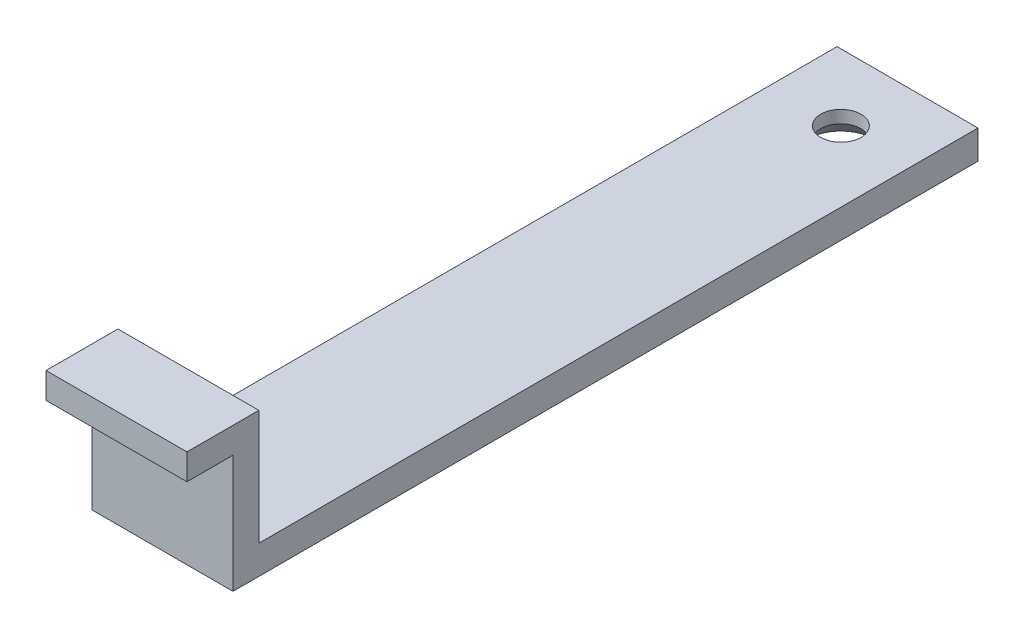
ISO-10303-21;
HEADER;
FILE_DESCRIPTION(('STEP AP214'),'2;1');
FILE_NAME('part.step','',(''),(''),'','','');
FILE_SCHEMA(('AUTOMOTIVE_DESIGN { 1 0 10303 214 1 1 1 1 }'));
ENDSEC;
DATA;
#1=APPLICATION_CONTEXT('core data for automotive mechanical design processes');
#2=APPLICATION_PROTOCOL_DEFINITION('international standard','automotive_design',2000,#1);
#3=PRODUCT_CONTEXT('',#1,'mechanical');
#4=PRODUCT('Part','Part','',(#3));
#5=PRODUCT_RELATED_PRODUCT_CATEGORY('part','',(#4));
#6=PRODUCT_DEFINITION_FORMATION('','',#4);
#7=PRODUCT_DEFINITION_CONTEXT('part definition',#1,'design');
#8=PRODUCT_DEFINITION('design','',#6,#7);
#9=PRODUCT_DEFINITION_SHAPE('','',#8);
#10=(LENGTH_UNIT() NAMED_UNIT(*) SI_UNIT(.MILLI.,.METRE.));
#11=(NAMED_UNIT(*) PLANE_ANGLE_UNIT() SI_UNIT($,.RADIAN.));
#12=(NAMED_UNIT(*) SI_UNIT($,.STERADIAN.) SOLID_ANGLE_UNIT());
#13=UNCERTAINTY_MEASURE_WITH_UNIT(LENGTH_MEASURE(1.E-05),#10,'distance_accuracy_value','');
#14=(GEOMETRIC_REPRESENTATION_CONTEXT(3) GLOBAL_UNCERTAINTY_ASSIGNED_CONTEXT((#13)) GLOBAL_UNIT_ASSIGNED_CONTEXT((#10,
#11,#12)) REPRESENTATION_CONTEXT('',''));
#15=CARTESIAN_POINT('',(0.,0.,0.));
#16=DIRECTION('',(0.,0.,1.));
#17=DIRECTION('',(1.,0.,0.));
#18=AXIS2_PLACEMENT_3D('',#15,#16,#17);
#19=CARTESIAN_POINT('',(-3.1115,3.175,-0.5715));
#20=DIRECTION('',(0.,0.,1.));
#21=DIRECTION('',(1.,0.,0.));
#22=AXIS2_PLACEMENT_3D('',#19,#20,#21);
#23=PLANE('',#22);
#24=DIRECTION('',(1.,0.,0.));
#25=VECTOR('',#24,1.);
#26=CARTESIAN_POINT('',(3.1115,-1.905,-0.5715));
#27=LINE('',#26,#25);
#28=CARTESIAN_POINT('',(-3.1115,-1.905,-0.5715));
#29=VERTEX_POINT('',#28);
#30=CARTESIAN_POINT('',(3.1115,-1.905,-0.5715));
#31=VERTEX_POINT('',#30);
#32=EDGE_CURVE('E64',#29,#31,#27,.T.);
#33=ORIENTED_EDGE('',*,*,#32,.F.);
#34=DIRECTION('',(0.,-1.,0.));
#35=VECTOR('',#34,1.);
#36=CARTESIAN_POINT('',(-3.1115,3.175,-0.5715));
#37=LINE('',#36,#35);
#38=CARTESIAN_POINT('',(-3.1115,3.175,-0.5715));
#39=VERTEX_POINT('',#38);
#40=EDGE_CURVE('E58',#39,#29,#37,.T.);
#41=ORIENTED_EDGE('',*,*,#40,.F.);
#42=DIRECTION('',(-1.,0.,0.));
#43=VECTOR('',#42,1.);
#44=CARTESIAN_POINT('',(-3.1115,3.175,-0.5715));
#45=LINE('',#44,#43);
#46=CARTESIAN_POINT('',(3.1115,3.175,-0.5715));
#47=VERTEX_POINT('',#46);
#48=EDGE_CURVE('E172',#47,#39,#45,.T.);
#49=ORIENTED_EDGE('',*,*,#48,.F.);
#50=DIRECTION('',(0.,-1.,0.));
#51=VECTOR('',#50,1.);
#52=CARTESIAN_POINT('',(3.1115,3.175,-0.5715));
#53=LINE('',#52,#51);
#54=EDGE_CURVE('E13',#47,#31,#53,.T.);
#55=ORIENTED_EDGE('',*,*,#54,.T.);
#56=EDGE_LOOP('',(#33,#41,#49,#55));
#57=FACE_BOUND('',#56,.T.);
#58=ADVANCED_FACE('F49',(#57),#23,.F.);
#59=CARTESIAN_POINT('',(-3.1115,3.175,0.5715));
#60=DIRECTION('',(0.,0.,-1.));
#61=DIRECTION('',(-1.,0.,0.));
#62=AXIS2_PLACEMENT_3D('',#59,#60,#61);
#63=PLANE('',#62);
#64=DIRECTION('',(1.,0.,0.));
#65=VECTOR('',#64,1.);
#66=CARTESIAN_POINT('',(-3.1115,2.032,0.5715));
#67=LINE('',#66,#65);
#68=CARTESIAN_POINT('',(-3.1115,2.032,0.5715));
#69=VERTEX_POINT('',#68);
#70=CARTESIAN_POINT('',(3.1115,2.032,0.5715));
#71=VERTEX_POINT('',#70);
#72=EDGE_CURVE('E72',#69,#71,#67,.T.);
#73=ORIENTED_EDGE('',*,*,#72,.F.);
#74=DIRECTION('',(0.,-1.,0.));
#75=VECTOR('',#74,1.);
#76=CARTESIAN_POINT('',(-3.1115,3.175,0.5715));
#77=LINE('',#76,#75);
#78=CARTESIAN_POINT('',(-3.1115,-3.175,0.5715));
#79=VERTEX_POINT('',#78);
#80=EDGE_CURVE('E180',#69,#79,#77,.T.);
#81=ORIENTED_EDGE('',*,*,#80,.T.);
#82=DIRECTION('',(1.,0.,0.));
#83=VECTOR('',#82,1.);
#84=CARTESIAN_POINT('',(-3.1115,-3.175,0.5715));
#85=LINE('',#84,#83);
#86=CARTESIAN_POINT('',(3.1115,-3.175,0.5715));
#87=VERTEX_POINT('',#86);
#88=EDGE_CURVE('E173',#79,#87,#85,.T.);
#89=ORIENTED_EDGE('',*,*,#88,.T.);
#90=DIRECTION('',(0.,-1.,0.));
#91=VECTOR('',#90,1.);
#92=CARTESIAN_POINT('',(3.1115,3.175,0.5715));
#93=LINE('',#92,#91);
#94=EDGE_CURVE('E121',#71,#87,#93,.T.);
#95=ORIENTED_EDGE('',*,*,#94,.F.);
#96=EDGE_LOOP('',(#73,#81,#89,#95));
#97=FACE_BOUND('',#96,.T.);
#98=ADVANCED_FACE('F211',(#97),#63,.F.);
#99=CARTESIAN_POINT('',(3.1115,3.175,-0.5715));
#100=DIRECTION('',(-1.,0.,0.));
#101=DIRECTION('',(0.,0.,1.));
#102=AXIS2_PLACEMENT_3D('',#99,#100,#101);
#103=PLANE('',#102);
#104=DIRECTION('',(0.,0.,-1.));
#105=VECTOR('',#104,1.);
#106=CARTESIAN_POINT('',(3.1115,-3.175,-0.5715));
#107=LINE('',#106,#105);
#108=CARTESIAN_POINT('',(3.1115,-3.175,-32.3215));
#109=VERTEX_POINT('',#108);
#110=EDGE_CURVE('E115',#87,#109,#107,.T.);
#111=ORIENTED_EDGE('',*,*,#110,.T.);
#112=DIRECTION('',(0.,-1.,0.));
#113=VECTOR('',#112,1.);
#114=CARTESIAN_POINT('',(3.1115,-3.175,-32.3215));
#115=LINE('',#114,#113);
#116=CARTESIAN_POINT('',(3.1115,-1.905,-32.3215));
#117=VERTEX_POINT('',#116);
#118=EDGE_CURVE('E119',#117,#109,#115,.T.);
#119=ORIENTED_EDGE('',*,*,#118,.F.);
#120=DIRECTION('',(0.,0.,1.));
#121=VECTOR('',#120,1.);
#122=CARTESIAN_POINT('',(3.1115,-1.905,-32.3215));
#123=LINE('',#122,#121);
#124=EDGE_CURVE('E147',#117,#31,#123,.T.);
#125=ORIENTED_EDGE('',*,*,#124,.T.);
#126=ORIENTED_EDGE('',*,*,#54,.F.);
#127=DIRECTION('',(0.,0.,-1.));
#128=VECTOR('',#127,1.);
#129=CARTESIAN_POINT('',(3.1115,3.175,-0.5715));
#130=LINE('',#129,#128);
#131=CARTESIAN_POINT('',(3.1115,3.175,2.6035));
#132=VERTEX_POINT('',#131);
#133=EDGE_CURVE('E169',#132,#47,#130,.T.);
#134=ORIENTED_EDGE('',*,*,#133,.F.);
#135=DIRECTION('',(0.,1.,0.));
#136=VECTOR('',#135,1.);
#137=CARTESIAN_POINT('',(3.1115,3.175,2.6035));
#138=LINE('',#137,#136);
#139=CARTESIAN_POINT('',(3.1115,2.032,2.6035));
#140=VERTEX_POINT('',#139);
#141=EDGE_CURVE('E158',#140,#132,#138,.T.);
#142=ORIENTED_EDGE('',*,*,#141,.F.);
#143=DIRECTION('',(0.,0.,-1.));
#144=VECTOR('',#143,1.);
#145=CARTESIAN_POINT('',(3.1115,2.032,2.6035));
#146=LINE('',#145,#144);
#147=EDGE_CURVE('E164',#140,#71,#146,.T.);
#148=ORIENTED_EDGE('',*,*,#147,.T.);
#149=ORIENTED_EDGE('',*,*,#94,.T.);
#150=EDGE_LOOP('',(#111,#119,#125,#126,#134,#142,#148,#149));
#151=FACE_BOUND('',#150,.T.);
#152=ADVANCED_FACE('F51',(#151),#103,.F.);
#153=CARTESIAN_POINT('',(-3.1115,3.175,-0.5715));
#154=DIRECTION('',(1.,0.,0.));
#155=DIRECTION('',(0.,0.,-1.));
#156=AXIS2_PLACEMENT_3D('',#153,#154,#155);
#157=PLANE('',#156);
#158=DIRECTION('',(0.,0.,1.));
#159=VECTOR('',#158,1.);
#160=CARTESIAN_POINT('',(-3.1115,-3.175,-0.5715));
#161=LINE('',#160,#159);
#162=CARTESIAN_POINT('',(-3.1115,-3.175,-32.3215));
#163=VERTEX_POINT('',#162);
#164=EDGE_CURVE('E125',#163,#79,#161,.T.);
#165=ORIENTED_EDGE('',*,*,#164,.T.);
#166=ORIENTED_EDGE('',*,*,#80,.F.);
#167=DIRECTION('',(0.,0.,-1.));
#168=VECTOR('',#167,1.);
#169=CARTESIAN_POINT('',(-3.1115,2.032,2.6035));
#170=LINE('',#169,#168);
#171=CARTESIAN_POINT('',(-3.1115,2.032,2.6035));
#172=VERTEX_POINT('',#171);
#173=EDGE_CURVE('E126',#172,#69,#170,.T.);
#174=ORIENTED_EDGE('',*,*,#173,.F.);
#175=DIRECTION('',(0.,-1.,0.));
#176=VECTOR('',#175,1.);
#177=CARTESIAN_POINT('',(-3.1115,3.175,2.6035));
#178=LINE('',#177,#176);
#179=CARTESIAN_POINT('',(-3.1115,3.175,2.6035));
#180=VERTEX_POINT('',#179);
#181=EDGE_CURVE('E153',#180,#172,#178,.T.);
#182=ORIENTED_EDGE('',*,*,#181,.F.);
#183=DIRECTION('',(0.,0.,1.));
#184=VECTOR('',#183,1.);
#185=CARTESIAN_POINT('',(-3.1115,3.175,-0.5715));
#186=LINE('',#185,#184);
#187=EDGE_CURVE('E175',#39,#180,#186,.T.);
#188=ORIENTED_EDGE('',*,*,#187,.F.);
#189=ORIENTED_EDGE('',*,*,#40,.T.);
#190=DIRECTION('',(0.,0.,1.));
#191=VECTOR('',#190,1.);
#192=CARTESIAN_POINT('',(-3.1115,-1.905,-32.3215));
#193=LINE('',#192,#191);
#194=CARTESIAN_POINT('',(-3.1115,-1.905,-32.3215));
#195=VERTEX_POINT('',#194);
#196=EDGE_CURVE('E150',#195,#29,#193,.T.);
#197=ORIENTED_EDGE('',*,*,#196,.F.);
#198=DIRECTION('',(0.,1.,0.));
#199=VECTOR('',#198,1.);
#200=CARTESIAN_POINT('',(-3.1115,-3.175,-32.3215));
#201=LINE('',#200,#199);
#202=EDGE_CURVE('E134',#163,#195,#201,.T.);
#203=ORIENTED_EDGE('',*,*,#202,.F.);
#204=EDGE_LOOP('',(#165,#166,#174,#182,#188,#189,#197,#203));
#205=FACE_BOUND('',#204,.T.);
#206=ADVANCED_FACE('F185',(#205),#157,.F.);
#207=CARTESIAN_POINT('',(0.,3.175,0.));
#208=DIRECTION('',(0.,1.,0.));
#209=DIRECTION('',(0.,0.,1.));
#210=AXIS2_PLACEMENT_3D('',#207,#208,#209);
#211=PLANE('',#210);
#212=ORIENTED_EDGE('',*,*,#133,.T.);
#213=ORIENTED_EDGE('',*,*,#48,.T.);
#214=ORIENTED_EDGE('',*,*,#187,.T.);
#215=DIRECTION('',(-1.,0.,0.));
#216=VECTOR('',#215,1.);
#217=CARTESIAN_POINT('',(-3.1115,3.175,2.6035));
#218=LINE('',#217,#216);
#219=EDGE_CURVE('E161',#132,#180,#218,.T.);
#220=ORIENTED_EDGE('',*,*,#219,.F.);
#221=EDGE_LOOP('',(#212,#213,#214,#220));
#222=FACE_BOUND('',#221,.T.);
#223=ADVANCED_FACE('F193',(#222),#211,.T.);
#224=CARTESIAN_POINT('',(0.,-3.175,0.));
#225=DIRECTION('',(0.,1.,0.));
#226=DIRECTION('',(0.,0.,1.));
#227=AXIS2_PLACEMENT_3D('',#224,#225,#226);
#228=PLANE('',#227);
#229=CARTESIAN_POINT('',(0.,-3.175,-29.3780388832374));
#230=DIRECTION('',(0.,-1.,0.));
#231=DIRECTION('',(0.,0.,-1.));
#232=AXIS2_PLACEMENT_3D('',#229,#230,#231);
#233=CIRCLE('',#232,1.5113);
#234=CARTESIAN_POINT('',(0.,-3.175,-30.8893388832374));
#235=VERTEX_POINT('',#234);
#236=EDGE_CURVE('E275',#235,#235,#233,.T.);
#237=ORIENTED_EDGE('',*,*,#236,.F.);
#238=EDGE_LOOP('',(#237));
#239=FACE_BOUND('',#238,.T.);
#240=ORIENTED_EDGE('',*,*,#110,.F.);
#241=ORIENTED_EDGE('',*,*,#88,.F.);
#242=ORIENTED_EDGE('',*,*,#164,.F.);
#243=DIRECTION('',(-1.,0.,0.));
#244=VECTOR('',#243,1.);
#245=CARTESIAN_POINT('',(3.1115,-3.175,-32.3215));
#246=LINE('',#245,#244);
#247=EDGE_CURVE('E129',#109,#163,#246,.T.);
#248=ORIENTED_EDGE('',*,*,#247,.F.);
#249=EDGE_LOOP('',(#240,#241,#242,#248));
#250=FACE_BOUND('',#249,.T.);
#251=ADVANCED_FACE('F130',(#239,#250),#228,.F.);
#252=CARTESIAN_POINT('',(-3.1115,2.032,2.6035));
#253=DIRECTION('',(0.,1.,0.));
#254=DIRECTION('',(0.,0.,1.));
#255=AXIS2_PLACEMENT_3D('',#252,#253,#254);
#256=PLANE('',#255);
#257=ORIENTED_EDGE('',*,*,#72,.T.);
#258=ORIENTED_EDGE('',*,*,#147,.F.);
#259=DIRECTION('',(1.,0.,0.));
#260=VECTOR('',#259,1.);
#261=CARTESIAN_POINT('',(-3.1115,2.032,2.6035));
#262=LINE('',#261,#260);
#263=EDGE_CURVE('E156',#172,#140,#262,.T.);
#264=ORIENTED_EDGE('',*,*,#263,.F.);
#265=ORIENTED_EDGE('',*,*,#173,.T.);
#266=EDGE_LOOP('',(#257,#258,#264,#265));
#267=FACE_BOUND('',#266,.T.);
#268=ADVANCED_FACE('F198',(#267),#256,.F.);
#269=CARTESIAN_POINT('',(0.,0.,2.6035));
#270=DIRECTION('',(0.,0.,1.));
#271=DIRECTION('',(1.,0.,0.));
#272=AXIS2_PLACEMENT_3D('',#269,#270,#271);
#273=PLANE('',#272);
#274=ORIENTED_EDGE('',*,*,#181,.T.);
#275=ORIENTED_EDGE('',*,*,#263,.T.);
#276=ORIENTED_EDGE('',*,*,#141,.T.);
#277=ORIENTED_EDGE('',*,*,#219,.T.);
#278=EDGE_LOOP('',(#274,#275,#276,#277));
#279=FACE_BOUND('',#278,.T.);
#280=ADVANCED_FACE('F195',(#279),#273,.T.);
#281=CARTESIAN_POINT('',(3.1115,-1.905,-32.3215));
#282=DIRECTION('',(0.,-1.,0.));
#283=DIRECTION('',(1.,0.,0.));
#284=AXIS2_PLACEMENT_3D('',#281,#282,#283);
#285=PLANE('',#284);
#286=CARTESIAN_POINT('',(0.,-1.905,-29.3780388832374));
#287=DIRECTION('',(0.,-1.,0.));
#288=DIRECTION('',(1.,0.,0.));
#289=AXIS2_PLACEMENT_3D('',#286,#287,#288);
#290=CIRCLE('',#289,0.888999999999994);
#291=CARTESIAN_POINT('',(0.888999999999994,-1.905,-29.3780388832374));
#292=VERTEX_POINT('',#291);
#293=EDGE_CURVE('E53',#292,#292,#290,.T.);
#294=ORIENTED_EDGE('',*,*,#293,.T.);
#295=EDGE_LOOP('',(#294));
#296=FACE_BOUND('',#295,.T.);
#297=ORIENTED_EDGE('',*,*,#32,.T.);
#298=ORIENTED_EDGE('',*,*,#124,.F.);
#299=DIRECTION('',(1.,0.,0.));
#300=VECTOR('',#299,1.);
#301=CARTESIAN_POINT('',(3.1115,-1.905,-32.3215));
#302=LINE('',#301,#300);
#303=EDGE_CURVE('E138',#195,#117,#302,.T.);
#304=ORIENTED_EDGE('',*,*,#303,.F.);
#305=ORIENTED_EDGE('',*,*,#196,.T.);
#306=EDGE_LOOP('',(#297,#298,#304,#305));
#307=FACE_BOUND('',#306,.T.);
#308=ADVANCED_FACE('F188',(#296,#307),#285,.F.);
#309=CARTESIAN_POINT('',(0.,0.,-32.3215));
#310=DIRECTION('',(0.,0.,1.));
#311=DIRECTION('',(1.,0.,0.));
#312=AXIS2_PLACEMENT_3D('',#309,#310,#311);
#313=PLANE('',#312);
#314=ORIENTED_EDGE('',*,*,#118,.T.);
#315=ORIENTED_EDGE('',*,*,#247,.T.);
#316=ORIENTED_EDGE('',*,*,#202,.T.);
#317=ORIENTED_EDGE('',*,*,#303,.T.);
#318=EDGE_LOOP('',(#314,#315,#316,#317));
#319=FACE_BOUND('',#318,.T.);
#320=ADVANCED_FACE('F136',(#319),#313,.F.);
#321=CARTESIAN_POINT('',(0.,-3.175,-29.3780388832374));
#322=DIRECTION('',(0.,-1.,0.));
#323=DIRECTION('',(0.,0.,-1.));
#324=AXIS2_PLACEMENT_3D('',#321,#322,#323);
#325=CYLINDRICAL_SURFACE('',#324,0.888999999999994);
#326=CARTESIAN_POINT('',(0.,-2.45912574018635,-29.3780388832374));
#327=DIRECTION('',(0.,-1.,0.));
#328=DIRECTION('',(0.,0.,-1.));
#329=AXIS2_PLACEMENT_3D('',#326,#327,#328);
#330=CIRCLE('',#329,0.888999999999989);
#331=CARTESIAN_POINT('',(0.,-2.45912574018635,-30.2670388832374));
#332=VERTEX_POINT('',#331);
#333=EDGE_CURVE('E143',#332,#332,#330,.T.);
#334=ORIENTED_EDGE('',*,*,#333,.T.);
#335=EDGE_LOOP('',(#334));
#336=FACE_BOUND('',#335,.T.);
#337=ORIENTED_EDGE('',*,*,#293,.F.);
#338=EDGE_LOOP('',(#337));
#339=FACE_BOUND('',#338,.T.);
#340=ADVANCED_FACE('F249',(#336,#339),#325,.F.);
#341=CARTESIAN_POINT('',(0.,-3.175,-29.3780388832374));
#342=DIRECTION('',(0.,-1.,0.));
#343=DIRECTION('',(0.,0.,-1.));
#344=AXIS2_PLACEMENT_3D('',#341,#342,#343);
#345=CONICAL_SURFACE('',#344,1.5113,0.715584993317673);
#346=ORIENTED_EDGE('',*,*,#333,.F.);
#347=EDGE_LOOP('',(#346));
#348=FACE_BOUND('',#347,.T.);
#349=ORIENTED_EDGE('',*,*,#236,.T.);
#350=EDGE_LOOP('',(#349));
#351=FACE_BOUND('',#350,.T.);
#352=ADVANCED_FACE('F254',(#348,#351),#345,.F.);
#353=CLOSED_SHELL('',(#58,#98,#152,#206,#223,#251,#268,#280,#308,#320,#340,#352));
#354=MANIFOLD_SOLID_BREP('B2',#353);
#355=ADVANCED_BREP_SHAPE_REPRESENTATION('',(#18,#354),#14);
#356=SHAPE_DEFINITION_REPRESENTATION(#9,#355);
ENDSEC;
END-ISO-10303-21;
